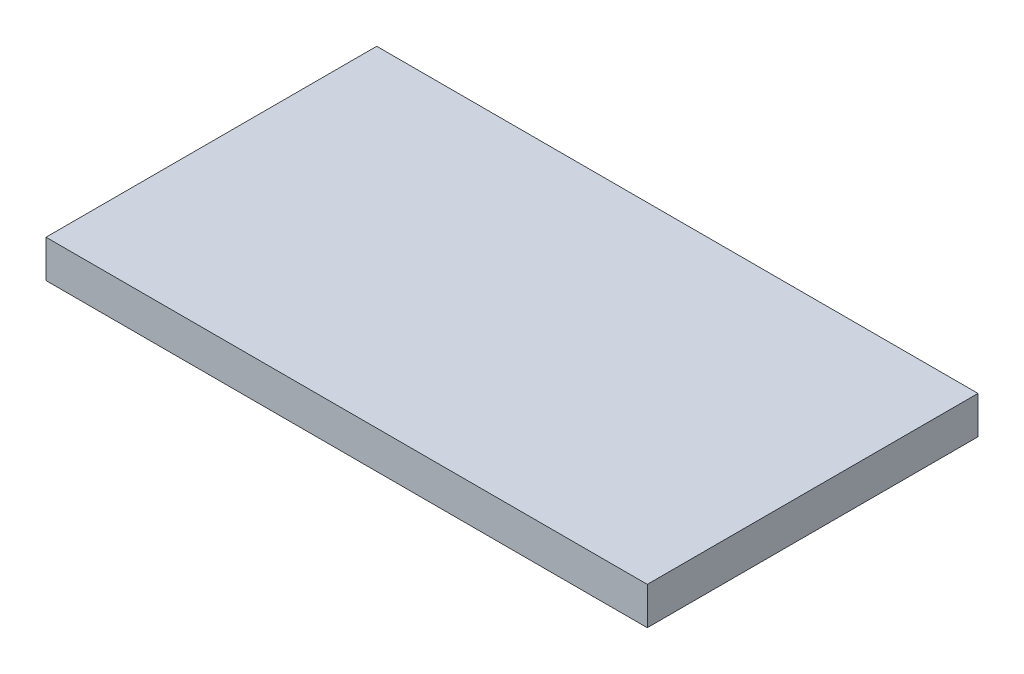
ISO-10303-21;
HEADER;
FILE_DESCRIPTION(('STEP AP214'),'2;1');
FILE_NAME('part.step','',(''),(''),'','','');
FILE_SCHEMA(('AUTOMOTIVE_DESIGN { 1 0 10303 214 1 1 1 1 }'));
ENDSEC;
DATA;
#1=APPLICATION_CONTEXT('core data for automotive mechanical design processes');
#2=APPLICATION_PROTOCOL_DEFINITION('international standard','automotive_design',2000,#1);
#3=PRODUCT_CONTEXT('',#1,'mechanical');
#4=PRODUCT('Part','Part','',(#3));
#5=PRODUCT_RELATED_PRODUCT_CATEGORY('part','',(#4));
#6=PRODUCT_DEFINITION_FORMATION('','',#4);
#7=PRODUCT_DEFINITION_CONTEXT('part definition',#1,'design');
#8=PRODUCT_DEFINITION('design','',#6,#7);
#9=PRODUCT_DEFINITION_SHAPE('','',#8);
#10=(LENGTH_UNIT() NAMED_UNIT(*) SI_UNIT(.MILLI.,.METRE.));
#11=(NAMED_UNIT(*) PLANE_ANGLE_UNIT() SI_UNIT($,.RADIAN.));
#12=(NAMED_UNIT(*) SI_UNIT($,.STERADIAN.) SOLID_ANGLE_UNIT());
#13=UNCERTAINTY_MEASURE_WITH_UNIT(LENGTH_MEASURE(1.E-05),#10,'distance_accuracy_value','');
#14=(GEOMETRIC_REPRESENTATION_CONTEXT(3) GLOBAL_UNCERTAINTY_ASSIGNED_CONTEXT((#13)) GLOBAL_UNIT_ASSIGNED_CONTEXT((#10,
#11,#12)) REPRESENTATION_CONTEXT('',''));
#15=CARTESIAN_POINT('',(0.,0.,0.));
#16=DIRECTION('',(0.,0.,1.));
#17=DIRECTION('',(1.,0.,0.));
#18=AXIS2_PLACEMENT_3D('',#15,#16,#17);
#19=CARTESIAN_POINT('',(80.,10.,-44.));
#20=DIRECTION('',(-1.,0.,0.));
#21=DIRECTION('',(0.,0.,1.));
#22=AXIS2_PLACEMENT_3D('',#19,#20,#21);
#23=PLANE('',#22);
#24=DIRECTION('',(0.,0.,-1.));
#25=VECTOR('',#24,1.);
#26=CARTESIAN_POINT('',(80.,0.,-44.));
#27=LINE('',#26,#25);
#28=CARTESIAN_POINT('',(80.,0.,44.));
#29=VERTEX_POINT('',#28);
#30=CARTESIAN_POINT('',(80.,0.,-44.));
#31=VERTEX_POINT('',#30);
#32=EDGE_CURVE('E107',#29,#31,#27,.T.);
#33=ORIENTED_EDGE('',*,*,#32,.T.);
#34=DIRECTION('',(0.,-1.,0.));
#35=VECTOR('',#34,1.);
#36=CARTESIAN_POINT('',(80.,10.,-44.));
#37=LINE('',#36,#35);
#38=CARTESIAN_POINT('',(80.,10.,-44.));
#39=VERTEX_POINT('',#38);
#40=EDGE_CURVE('E11',#39,#31,#37,.T.);
#41=ORIENTED_EDGE('',*,*,#40,.F.);
#42=DIRECTION('',(0.,0.,-1.));
#43=VECTOR('',#42,1.);
#44=CARTESIAN_POINT('',(80.,10.,-44.));
#45=LINE('',#44,#43);
#46=CARTESIAN_POINT('',(80.,10.,44.));
#47=VERTEX_POINT('',#46);
#48=EDGE_CURVE('E91',#47,#39,#45,.T.);
#49=ORIENTED_EDGE('',*,*,#48,.F.);
#50=DIRECTION('',(0.,-1.,0.));
#51=VECTOR('',#50,1.);
#52=CARTESIAN_POINT('',(80.,10.,44.));
#53=LINE('',#52,#51);
#54=EDGE_CURVE('E103',#47,#29,#53,.T.);
#55=ORIENTED_EDGE('',*,*,#54,.T.);
#56=EDGE_LOOP('',(#33,#41,#49,#55));
#57=FACE_BOUND('',#56,.T.);
#58=ADVANCED_FACE('F39',(#57),#23,.F.);
#59=CARTESIAN_POINT('',(-80.,10.,-44.));
#60=DIRECTION('',(0.,0.,1.));
#61=DIRECTION('',(1.,0.,0.));
#62=AXIS2_PLACEMENT_3D('',#59,#60,#61);
#63=PLANE('',#62);
#64=DIRECTION('',(-1.,0.,0.));
#65=VECTOR('',#64,1.);
#66=CARTESIAN_POINT('',(-80.,0.,-44.));
#67=LINE('',#66,#65);
#68=CARTESIAN_POINT('',(-80.,0.,-44.));
#69=VERTEX_POINT('',#68);
#70=EDGE_CURVE('E96',#31,#69,#67,.T.);
#71=ORIENTED_EDGE('',*,*,#70,.T.);
#72=DIRECTION('',(0.,-1.,0.));
#73=VECTOR('',#72,1.);
#74=CARTESIAN_POINT('',(-80.,10.,-44.));
#75=LINE('',#74,#73);
#76=CARTESIAN_POINT('',(-80.,10.,-44.));
#77=VERTEX_POINT('',#76);
#78=EDGE_CURVE('E48',#77,#69,#75,.T.);
#79=ORIENTED_EDGE('',*,*,#78,.F.);
#80=DIRECTION('',(-1.,0.,0.));
#81=VECTOR('',#80,1.);
#82=CARTESIAN_POINT('',(-80.,10.,-44.));
#83=LINE('',#82,#81);
#84=EDGE_CURVE('E86',#39,#77,#83,.T.);
#85=ORIENTED_EDGE('',*,*,#84,.F.);
#86=ORIENTED_EDGE('',*,*,#40,.T.);
#87=EDGE_LOOP('',(#71,#79,#85,#86));
#88=FACE_BOUND('',#87,.T.);
#89=ADVANCED_FACE('F95',(#88),#63,.F.);
#90=CARTESIAN_POINT('',(-80.,10.,-44.));
#91=DIRECTION('',(1.,0.,0.));
#92=DIRECTION('',(0.,0.,-1.));
#93=AXIS2_PLACEMENT_3D('',#90,#91,#92);
#94=PLANE('',#93);
#95=DIRECTION('',(0.,0.,1.));
#96=VECTOR('',#95,1.);
#97=CARTESIAN_POINT('',(-80.,0.,-44.));
#98=LINE('',#97,#96);
#99=CARTESIAN_POINT('',(-80.,0.,44.));
#100=VERTEX_POINT('',#99);
#101=EDGE_CURVE('E73',#69,#100,#98,.T.);
#102=ORIENTED_EDGE('',*,*,#101,.T.);
#103=DIRECTION('',(0.,-1.,0.));
#104=VECTOR('',#103,1.);
#105=CARTESIAN_POINT('',(-80.,10.,44.));
#106=LINE('',#105,#104);
#107=CARTESIAN_POINT('',(-80.,10.,44.));
#108=VERTEX_POINT('',#107);
#109=EDGE_CURVE('E98',#108,#100,#106,.T.);
#110=ORIENTED_EDGE('',*,*,#109,.F.);
#111=DIRECTION('',(0.,0.,1.));
#112=VECTOR('',#111,1.);
#113=CARTESIAN_POINT('',(-80.,10.,-44.));
#114=LINE('',#113,#112);
#115=EDGE_CURVE('E89',#77,#108,#114,.T.);
#116=ORIENTED_EDGE('',*,*,#115,.F.);
#117=ORIENTED_EDGE('',*,*,#78,.T.);
#118=EDGE_LOOP('',(#102,#110,#116,#117));
#119=FACE_BOUND('',#118,.T.);
#120=ADVANCED_FACE('F99',(#119),#94,.F.);
#121=CARTESIAN_POINT('',(-80.,10.,44.));
#122=DIRECTION('',(0.,0.,-1.));
#123=DIRECTION('',(-1.,0.,0.));
#124=AXIS2_PLACEMENT_3D('',#121,#122,#123);
#125=PLANE('',#124);
#126=DIRECTION('',(1.,0.,0.));
#127=VECTOR('',#126,1.);
#128=CARTESIAN_POINT('',(-80.,0.,44.));
#129=LINE('',#128,#127);
#130=EDGE_CURVE('E79',#100,#29,#129,.T.);
#131=ORIENTED_EDGE('',*,*,#130,.T.);
#132=ORIENTED_EDGE('',*,*,#54,.F.);
#133=DIRECTION('',(1.,0.,0.));
#134=VECTOR('',#133,1.);
#135=CARTESIAN_POINT('',(-80.,10.,44.));
#136=LINE('',#135,#134);
#137=EDGE_CURVE('E56',#108,#47,#136,.T.);
#138=ORIENTED_EDGE('',*,*,#137,.F.);
#139=ORIENTED_EDGE('',*,*,#109,.T.);
#140=EDGE_LOOP('',(#131,#132,#138,#139));
#141=FACE_BOUND('',#140,.T.);
#142=ADVANCED_FACE('F120',(#141),#125,.F.);
#143=CARTESIAN_POINT('',(0.,10.,0.));
#144=DIRECTION('',(0.,1.,0.));
#145=DIRECTION('',(0.,0.,1.));
#146=AXIS2_PLACEMENT_3D('',#143,#144,#145);
#147=PLANE('',#146);
#148=ORIENTED_EDGE('',*,*,#48,.T.);
#149=ORIENTED_EDGE('',*,*,#84,.T.);
#150=ORIENTED_EDGE('',*,*,#115,.T.);
#151=ORIENTED_EDGE('',*,*,#137,.T.);
#152=EDGE_LOOP('',(#148,#149,#150,#151));
#153=FACE_BOUND('',#152,.T.);
#154=ADVANCED_FACE('F87',(#153),#147,.T.);
#155=CARTESIAN_POINT('',(0.,0.,0.));
#156=DIRECTION('',(0.,1.,0.));
#157=DIRECTION('',(0.,0.,1.));
#158=AXIS2_PLACEMENT_3D('',#155,#156,#157);
#159=PLANE('',#158);
#160=ORIENTED_EDGE('',*,*,#32,.F.);
#161=ORIENTED_EDGE('',*,*,#130,.F.);
#162=ORIENTED_EDGE('',*,*,#101,.F.);
#163=ORIENTED_EDGE('',*,*,#70,.F.);
#164=EDGE_LOOP('',(#160,#161,#162,#163));
#165=FACE_BOUND('',#164,.T.);
#166=ADVANCED_FACE('F123',(#165),#159,.F.);
#167=CLOSED_SHELL('',(#58,#89,#120,#142,#154,#166));
#168=MANIFOLD_SOLID_BREP('B2',#167);
#169=ADVANCED_BREP_SHAPE_REPRESENTATION('',(#18,#168),#14);
#170=SHAPE_DEFINITION_REPRESENTATION(#9,#169);
ENDSEC;
END-ISO-10303-21;
